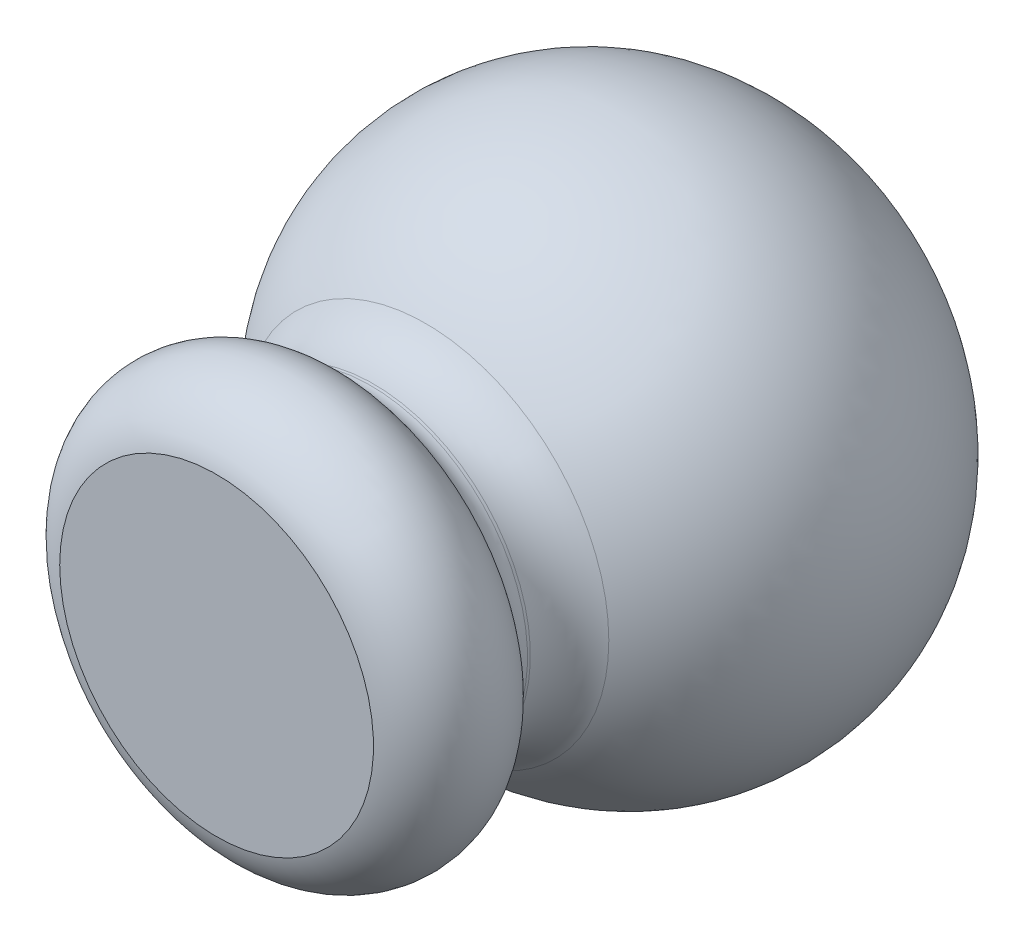
ISO-10303-21;
HEADER;
FILE_DESCRIPTION(('STEP AP214'),'2;1');
FILE_NAME('part.step','',(''),(''),'','','');
FILE_SCHEMA(('AUTOMOTIVE_DESIGN { 1 0 10303 214 1 1 1 1 }'));
ENDSEC;
DATA;
#1=APPLICATION_CONTEXT('core data for automotive mechanical design processes');
#2=APPLICATION_PROTOCOL_DEFINITION('international standard','automotive_design',2000,#1);
#3=PRODUCT_CONTEXT('',#1,'mechanical');
#4=PRODUCT('Part','Part','',(#3));
#5=PRODUCT_RELATED_PRODUCT_CATEGORY('part','',(#4));
#6=PRODUCT_DEFINITION_FORMATION('','',#4);
#7=PRODUCT_DEFINITION_CONTEXT('part definition',#1,'design');
#8=PRODUCT_DEFINITION('design','',#6,#7);
#9=PRODUCT_DEFINITION_SHAPE('','',#8);
#10=(LENGTH_UNIT() NAMED_UNIT(*) SI_UNIT(.MILLI.,.METRE.));
#11=(NAMED_UNIT(*) PLANE_ANGLE_UNIT() SI_UNIT($,.RADIAN.));
#12=(NAMED_UNIT(*) SI_UNIT($,.STERADIAN.) SOLID_ANGLE_UNIT());
#13=UNCERTAINTY_MEASURE_WITH_UNIT(LENGTH_MEASURE(1.E-05),#10,'distance_accuracy_value','');
#14=(GEOMETRIC_REPRESENTATION_CONTEXT(3) GLOBAL_UNCERTAINTY_ASSIGNED_CONTEXT((#13)) GLOBAL_UNIT_ASSIGNED_CONTEXT((#10,
#11,#12)) REPRESENTATION_CONTEXT('',''));
#15=CARTESIAN_POINT('',(0.,0.,0.));
#16=DIRECTION('',(0.,0.,1.));
#17=DIRECTION('',(1.,0.,0.));
#18=AXIS2_PLACEMENT_3D('',#15,#16,#17);
#19=CARTESIAN_POINT('',(-1.2,0.,7.));
#20=DIRECTION('',(0.,0.,-1.));
#21=DIRECTION('',(-1.,0.,0.));
#22=AXIS2_PLACEMENT_3D('',#19,#20,#21);
#23=PLANE('',#22);
#24=CARTESIAN_POINT('',(0.,0.,7.));
#25=DIRECTION('',(0.,0.,-1.));
#26=DIRECTION('',(-1.,0.,0.));
#27=AXIS2_PLACEMENT_3D('',#24,#25,#26);
#28=CIRCLE('',#27,1.2);
#29=CARTESIAN_POINT('',(-1.2,0.,7.));
#30=VERTEX_POINT('',#29);
#31=EDGE_CURVE('E10',#30,#30,#28,.T.);
#32=ORIENTED_EDGE('',*,*,#31,.T.);
#33=EDGE_LOOP('',(#32));
#34=FACE_BOUND('',#33,.T.);
#35=ADVANCED_FACE('F32',(#34),#23,.T.);
#36=CARTESIAN_POINT('',(0.,0.,0.));
#37=DIRECTION('',(0.,0.,-1.));
#38=DIRECTION('',(-1.,0.,0.));
#39=AXIS2_PLACEMENT_3D('',#36,#37,#38);
#40=CYLINDRICAL_SURFACE('',#39,1.2);
#41=CARTESIAN_POINT('',(0.,0.,0.));
#42=DIRECTION('',(0.,0.,-1.));
#43=DIRECTION('',(-1.,0.,0.));
#44=AXIS2_PLACEMENT_3D('',#41,#42,#43);
#45=CIRCLE('',#44,1.2);
#46=CARTESIAN_POINT('',(-1.2,0.,0.));
#47=VERTEX_POINT('',#46);
#48=EDGE_CURVE('E38',#47,#47,#45,.T.);
#49=ORIENTED_EDGE('',*,*,#48,.T.);
#50=EDGE_LOOP('',(#49));
#51=FACE_BOUND('',#50,.T.);
#52=ORIENTED_EDGE('',*,*,#31,.F.);
#53=EDGE_LOOP('',(#52));
#54=FACE_BOUND('',#53,.T.);
#55=ADVANCED_FACE('F76',(#51,#54),#40,.F.);
#56=CARTESIAN_POINT('',(-3.5,0.,0.));
#57=DIRECTION('',(0.,0.,-1.));
#58=DIRECTION('',(-1.,0.,0.));
#59=AXIS2_PLACEMENT_3D('',#56,#57,#58);
#60=PLANE('',#59);
#61=CARTESIAN_POINT('',(0.,0.,0.));
#62=DIRECTION('',(0.,0.,-1.));
#63=DIRECTION('',(-1.,0.,0.));
#64=AXIS2_PLACEMENT_3D('',#61,#62,#63);
#65=CIRCLE('',#64,3.5);
#66=CARTESIAN_POINT('',(-3.5,0.,0.));
#67=VERTEX_POINT('',#66);
#68=EDGE_CURVE('E42',#67,#67,#65,.T.);
#69=ORIENTED_EDGE('',*,*,#68,.T.);
#70=EDGE_LOOP('',(#69));
#71=FACE_BOUND('',#70,.T.);
#72=ORIENTED_EDGE('',*,*,#48,.F.);
#73=EDGE_LOOP('',(#72));
#74=FACE_BOUND('',#73,.T.);
#75=ADVANCED_FACE('F80',(#71,#74),#60,.T.);
#76=CARTESIAN_POINT('',(0.,0.,3.5));
#77=DIRECTION('',(0.,0.,-1.));
#78=DIRECTION('',(-1.,0.,0.));
#79=AXIS2_PLACEMENT_3D('',#76,#77,#78);
#80=DEGENERATE_TOROIDAL_SURFACE('',#79,0.874999999999998,4.375,.T.);
#81=CARTESIAN_POINT('',(0.,0.,7.));
#82=DIRECTION('',(0.,0.,-1.));
#83=DIRECTION('',(-1.,0.,0.));
#84=AXIS2_PLACEMENT_3D('',#81,#82,#83);
#85=CIRCLE('',#84,3.5);
#86=CARTESIAN_POINT('',(-3.5,0.,7.));
#87=VERTEX_POINT('',#86);
#88=EDGE_CURVE('E46',#87,#87,#85,.T.);
#89=ORIENTED_EDGE('',*,*,#88,.T.);
#90=EDGE_LOOP('',(#89));
#91=FACE_BOUND('',#90,.T.);
#92=ORIENTED_EDGE('',*,*,#68,.F.);
#93=EDGE_LOOP('',(#92));
#94=FACE_BOUND('',#93,.T.);
#95=ADVANCED_FACE('F84',(#91,#94),#80,.T.);
#96=CARTESIAN_POINT('',(0.,0.,8.));
#97=DIRECTION('',(0.,0.,-1.));
#98=DIRECTION('',(-1.,0.,0.));
#99=AXIS2_PLACEMENT_3D('',#96,#97,#98);
#100=TOROIDAL_SURFACE('',#99,4.25,1.25);
#101=CARTESIAN_POINT('',(0.,0.,8.));
#102=DIRECTION('',(0.,0.,-1.));
#103=DIRECTION('',(-1.,0.,0.));
#104=AXIS2_PLACEMENT_3D('',#101,#102,#103);
#105=CIRCLE('',#104,3.);
#106=CARTESIAN_POINT('',(-3.,0.,8.));
#107=VERTEX_POINT('',#106);
#108=EDGE_CURVE('E51',#107,#107,#105,.T.);
#109=ORIENTED_EDGE('',*,*,#108,.T.);
#110=EDGE_LOOP('',(#109));
#111=FACE_BOUND('',#110,.T.);
#112=ORIENTED_EDGE('',*,*,#88,.F.);
#113=EDGE_LOOP('',(#112));
#114=FACE_BOUND('',#113,.T.);
#115=ADVANCED_FACE('F91',(#111,#114),#100,.F.);
#116=CARTESIAN_POINT('',(0.,0.,0.));
#117=DIRECTION('',(0.,0.,-1.));
#118=DIRECTION('',(-1.,0.,0.));
#119=AXIS2_PLACEMENT_3D('',#116,#117,#118);
#120=CYLINDRICAL_SURFACE('',#119,3.);
#121=CARTESIAN_POINT('',(0.,0.,8.05438171673504));
#122=DIRECTION('',(0.,0.,-1.));
#123=DIRECTION('',(-1.,0.,0.));
#124=AXIS2_PLACEMENT_3D('',#121,#122,#123);
#125=CIRCLE('',#124,3.);
#126=CARTESIAN_POINT('',(-3.,0.,8.05438171673504));
#127=VERTEX_POINT('',#126);
#128=EDGE_CURVE('E54',#127,#127,#125,.T.);
#129=ORIENTED_EDGE('',*,*,#128,.T.);
#130=EDGE_LOOP('',(#129));
#131=FACE_BOUND('',#130,.T.);
#132=ORIENTED_EDGE('',*,*,#108,.F.);
#133=EDGE_LOOP('',(#132));
#134=FACE_BOUND('',#133,.T.);
#135=ADVANCED_FACE('F95',(#131,#134),#120,.T.);
#136=CARTESIAN_POINT('',(0.,0.,8.05438171673504));
#137=DIRECTION('',(0.,0.,-1.));
#138=DIRECTION('',(-1.,0.,0.));
#139=AXIS2_PLACEMENT_3D('',#136,#137,#138);
#140=TOROIDAL_SURFACE('',#139,3.5,0.5);
#141=CARTESIAN_POINT('',(0.,0.,8.5));
#142=DIRECTION('',(0.,0.,-1.));
#143=DIRECTION('',(-1.,0.,0.));
#144=AXIS2_PLACEMENT_3D('',#141,#142,#143);
#145=CIRCLE('',#144,3.27323063341803);
#146=CARTESIAN_POINT('',(-3.27323063341803,0.,8.5));
#147=VERTEX_POINT('',#146);
#148=EDGE_CURVE('E57',#147,#147,#145,.T.);
#149=ORIENTED_EDGE('',*,*,#148,.T.);
#150=EDGE_LOOP('',(#149));
#151=FACE_BOUND('',#150,.T.);
#152=ORIENTED_EDGE('',*,*,#128,.F.);
#153=EDGE_LOOP('',(#152));
#154=FACE_BOUND('',#153,.T.);
#155=ADVANCED_FACE('F73',(#151,#154),#140,.F.);
#156=CARTESIAN_POINT('',(0.,0.,9.69828546119625));
#157=DIRECTION('',(0.,0.,-1.));
#158=DIRECTION('',(-1.,0.,0.));
#159=AXIS2_PLACEMENT_3D('',#156,#157,#158);
#160=TOROIDAL_SURFACE('',#159,2.66343869887507,1.34452008164548);
#161=CARTESIAN_POINT('',(0.,0.,11.));
#162=DIRECTION('',(0.,0.,-1.));
#163=DIRECTION('',(-1.,0.,0.));
#164=AXIS2_PLACEMENT_3D('',#161,#162,#163);
#165=CIRCLE('',#164,3.);
#166=CARTESIAN_POINT('',(-3.,0.,11.));
#167=VERTEX_POINT('',#166);
#168=EDGE_CURVE('E60',#167,#167,#165,.T.);
#169=ORIENTED_EDGE('',*,*,#168,.T.);
#170=EDGE_LOOP('',(#169));
#171=FACE_BOUND('',#170,.T.);
#172=ORIENTED_EDGE('',*,*,#148,.F.);
#173=EDGE_LOOP('',(#172));
#174=FACE_BOUND('',#173,.T.);
#175=ADVANCED_FACE('F64',(#171,#174),#160,.T.);
#176=CARTESIAN_POINT('',(-3.,0.,11.));
#177=DIRECTION('',(0.,0.,1.));
#178=DIRECTION('',(1.,0.,0.));
#179=AXIS2_PLACEMENT_3D('',#176,#177,#178);
#180=PLANE('',#179);
#181=ORIENTED_EDGE('',*,*,#168,.F.);
#182=EDGE_LOOP('',(#181));
#183=FACE_BOUND('',#182,.T.);
#184=ADVANCED_FACE('F67',(#183),#180,.T.);
#185=CLOSED_SHELL('',(#35,#55,#75,#95,#115,#135,#155,#175,#184));
#186=MANIFOLD_SOLID_BREP('B2',#185);
#187=ADVANCED_BREP_SHAPE_REPRESENTATION('',(#18,#186),#14);
#188=SHAPE_DEFINITION_REPRESENTATION(#9,#187);
ENDSEC;
END-ISO-10303-21;
